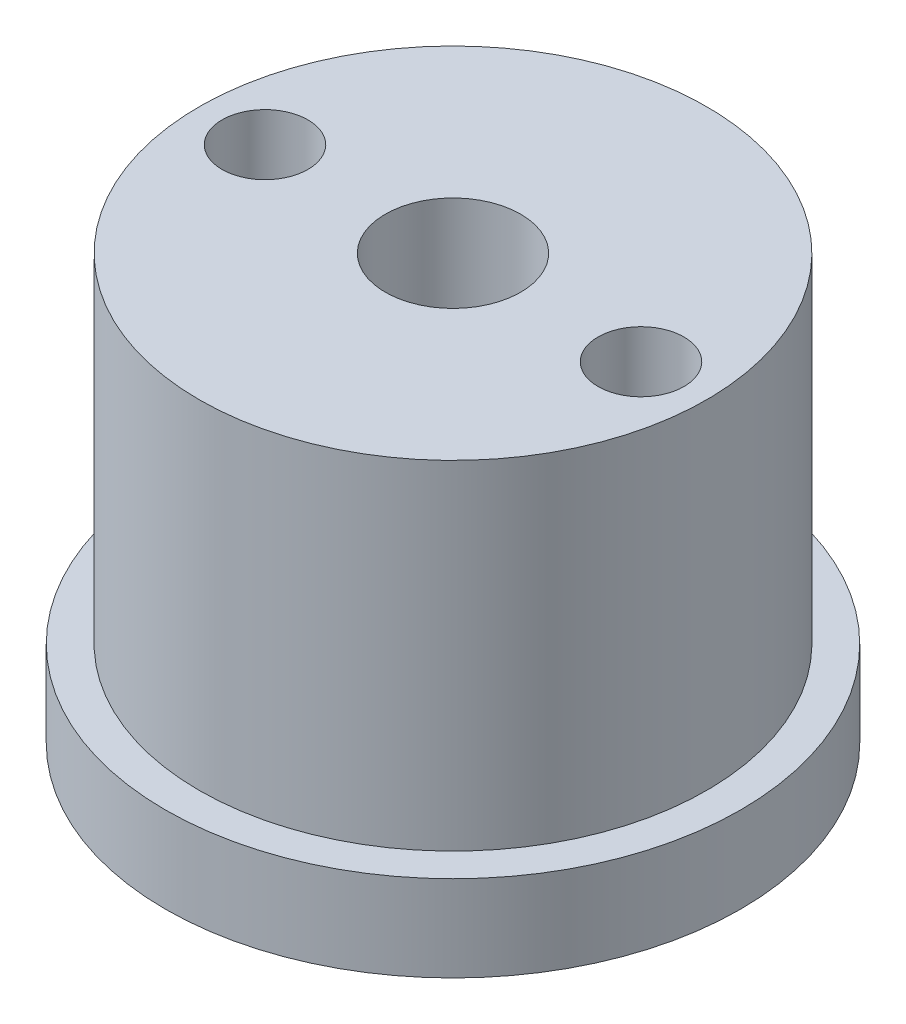
ISO-10303-21;
HEADER;
FILE_DESCRIPTION(('STEP AP214'),'2;1');
FILE_NAME('part.step','',(''),(''),'','','');
FILE_SCHEMA(('AUTOMOTIVE_DESIGN { 1 0 10303 214 1 1 1 1 }'));
ENDSEC;
DATA;
#1=APPLICATION_CONTEXT('core data for automotive mechanical design processes');
#2=APPLICATION_PROTOCOL_DEFINITION('international standard','automotive_design',2000,#1);
#3=PRODUCT_CONTEXT('',#1,'mechanical');
#4=PRODUCT('Part','Part','',(#3));
#5=PRODUCT_RELATED_PRODUCT_CATEGORY('part','',(#4));
#6=PRODUCT_DEFINITION_FORMATION('','',#4);
#7=PRODUCT_DEFINITION_CONTEXT('part definition',#1,'design');
#8=PRODUCT_DEFINITION('design','',#6,#7);
#9=PRODUCT_DEFINITION_SHAPE('','',#8);
#10=(LENGTH_UNIT() NAMED_UNIT(*) SI_UNIT(.MILLI.,.METRE.));
#11=(NAMED_UNIT(*) PLANE_ANGLE_UNIT() SI_UNIT($,.RADIAN.));
#12=(NAMED_UNIT(*) SI_UNIT($,.STERADIAN.) SOLID_ANGLE_UNIT());
#13=UNCERTAINTY_MEASURE_WITH_UNIT(LENGTH_MEASURE(1.E-05),#10,'distance_accuracy_value','');
#14=(GEOMETRIC_REPRESENTATION_CONTEXT(3) GLOBAL_UNCERTAINTY_ASSIGNED_CONTEXT((#13)) GLOBAL_UNIT_ASSIGNED_CONTEXT((#10,
#11,#12)) REPRESENTATION_CONTEXT('',''));
#15=CARTESIAN_POINT('',(0.,0.,0.));
#16=DIRECTION('',(0.,0.,1.));
#17=DIRECTION('',(1.,0.,0.));
#18=AXIS2_PLACEMENT_3D('',#15,#16,#17);
#19=CARTESIAN_POINT('',(0.,10.,0.));
#20=DIRECTION('',(0.,1.,0.));
#21=DIRECTION('',(0.,0.,1.));
#22=AXIS2_PLACEMENT_3D('',#19,#20,#21);
#23=CYLINDRICAL_SURFACE('',#22,7.5);
#24=CARTESIAN_POINT('',(0.,0.,0.));
#25=DIRECTION('',(0.,1.,0.));
#26=DIRECTION('',(0.,0.,1.));
#27=AXIS2_PLACEMENT_3D('',#24,#25,#26);
#28=CIRCLE('',#27,7.5);
#29=CARTESIAN_POINT('',(0.,0.,7.5));
#30=VERTEX_POINT('',#29);
#31=EDGE_CURVE('E52',#30,#30,#28,.T.);
#32=ORIENTED_EDGE('',*,*,#31,.T.);
#33=EDGE_LOOP('',(#32));
#34=FACE_BOUND('',#33,.T.);
#35=CARTESIAN_POINT('',(0.,10.,0.));
#36=DIRECTION('',(0.,1.,0.));
#37=DIRECTION('',(0.,0.,1.));
#38=AXIS2_PLACEMENT_3D('',#35,#36,#37);
#39=CIRCLE('',#38,7.5);
#40=CARTESIAN_POINT('',(0.,10.,7.5));
#41=VERTEX_POINT('',#40);
#42=EDGE_CURVE('E10',#41,#41,#39,.T.);
#43=ORIENTED_EDGE('',*,*,#42,.F.);
#44=EDGE_LOOP('',(#43));
#45=FACE_BOUND('',#44,.T.);
#46=ADVANCED_FACE('F31',(#34,#45),#23,.T.);
#47=CARTESIAN_POINT('',(-7.5,10.,0.));
#48=DIRECTION('',(0.,1.,0.));
#49=DIRECTION('',(0.,0.,1.));
#50=AXIS2_PLACEMENT_3D('',#47,#48,#49);
#51=PLANE('',#50);
#52=CARTESIAN_POINT('',(0.,10.,0.));
#53=DIRECTION('',(0.,-1.,0.));
#54=DIRECTION('',(0.,0.,-1.));
#55=AXIS2_PLACEMENT_3D('',#52,#53,#54);
#56=CIRCLE('',#55,2.);
#57=CARTESIAN_POINT('',(0.,10.,-2.));
#58=VERTEX_POINT('',#57);
#59=EDGE_CURVE('E59',#58,#58,#56,.T.);
#60=ORIENTED_EDGE('',*,*,#59,.T.);
#61=EDGE_LOOP('',(#60));
#62=FACE_BOUND('',#61,.T.);
#63=CARTESIAN_POINT('',(-5.55625,10.,0.));
#64=DIRECTION('',(0.,1.,0.));
#65=DIRECTION('',(0.,0.,1.));
#66=AXIS2_PLACEMENT_3D('',#63,#64,#65);
#67=CIRCLE('',#66,1.27);
#68=CARTESIAN_POINT('',(-5.55625,10.,1.27));
#69=VERTEX_POINT('',#68);
#70=EDGE_CURVE('E48',#69,#69,#67,.T.);
#71=ORIENTED_EDGE('',*,*,#70,.F.);
#72=EDGE_LOOP('',(#71));
#73=FACE_BOUND('',#72,.T.);
#74=CARTESIAN_POINT('',(5.55625,10.,0.));
#75=DIRECTION('',(0.,1.,0.));
#76=DIRECTION('',(0.,0.,1.));
#77=AXIS2_PLACEMENT_3D('',#74,#75,#76);
#78=CIRCLE('',#77,1.27);
#79=CARTESIAN_POINT('',(5.55625,10.,1.27));
#80=VERTEX_POINT('',#79);
#81=EDGE_CURVE('E54',#80,#80,#78,.T.);
#82=ORIENTED_EDGE('',*,*,#81,.F.);
#83=EDGE_LOOP('',(#82));
#84=FACE_BOUND('',#83,.T.);
#85=ORIENTED_EDGE('',*,*,#42,.T.);
#86=EDGE_LOOP('',(#85));
#87=FACE_BOUND('',#86,.T.);
#88=ADVANCED_FACE('F83',(#62,#73,#84,#87),#51,.T.);
#89=CARTESIAN_POINT('',(-8.5,-2.54,0.));
#90=DIRECTION('',(0.,-1.,0.));
#91=DIRECTION('',(0.,0.,-1.));
#92=AXIS2_PLACEMENT_3D('',#89,#90,#91);
#93=PLANE('',#92);
#94=CARTESIAN_POINT('',(0.,-2.54,0.));
#95=DIRECTION('',(0.,-1.,0.));
#96=DIRECTION('',(0.,0.,-1.));
#97=AXIS2_PLACEMENT_3D('',#94,#95,#96);
#98=CIRCLE('',#97,2.);
#99=CARTESIAN_POINT('',(0.,-2.54,-2.));
#100=VERTEX_POINT('',#99);
#101=EDGE_CURVE('E62',#100,#100,#98,.T.);
#102=ORIENTED_EDGE('',*,*,#101,.F.);
#103=EDGE_LOOP('',(#102));
#104=FACE_BOUND('',#103,.T.);
#105=CARTESIAN_POINT('',(-5.55625,-2.54,0.));
#106=DIRECTION('',(0.,-1.,0.));
#107=DIRECTION('',(0.,0.,-1.));
#108=AXIS2_PLACEMENT_3D('',#105,#106,#107);
#109=CIRCLE('',#108,1.27);
#110=CARTESIAN_POINT('',(-5.55625,-2.54,-1.27));
#111=VERTEX_POINT('',#110);
#112=EDGE_CURVE('E34',#111,#111,#109,.T.);
#113=ORIENTED_EDGE('',*,*,#112,.F.);
#114=EDGE_LOOP('',(#113));
#115=FACE_BOUND('',#114,.T.);
#116=CARTESIAN_POINT('',(5.55625,-2.54,0.));
#117=DIRECTION('',(0.,-1.,0.));
#118=DIRECTION('',(0.,0.,-1.));
#119=AXIS2_PLACEMENT_3D('',#116,#117,#118);
#120=CIRCLE('',#119,1.27);
#121=CARTESIAN_POINT('',(5.55625,-2.54,-1.27));
#122=VERTEX_POINT('',#121);
#123=EDGE_CURVE('E46',#122,#122,#120,.T.);
#124=ORIENTED_EDGE('',*,*,#123,.F.);
#125=EDGE_LOOP('',(#124));
#126=FACE_BOUND('',#125,.T.);
#127=CARTESIAN_POINT('',(0.,-2.54,0.));
#128=DIRECTION('',(0.,1.,0.));
#129=DIRECTION('',(0.,0.,1.));
#130=AXIS2_PLACEMENT_3D('',#127,#128,#129);
#131=CIRCLE('',#130,8.5);
#132=CARTESIAN_POINT('',(0.,-2.54,8.5));
#133=VERTEX_POINT('',#132);
#134=EDGE_CURVE('E38',#133,#133,#131,.T.);
#135=ORIENTED_EDGE('',*,*,#134,.F.);
#136=EDGE_LOOP('',(#135));
#137=FACE_BOUND('',#136,.T.);
#138=ADVANCED_FACE('F74',(#104,#115,#126,#137),#93,.T.);
#139=CARTESIAN_POINT('',(0.,10.,0.));
#140=DIRECTION('',(0.,1.,0.));
#141=DIRECTION('',(0.,0.,1.));
#142=AXIS2_PLACEMENT_3D('',#139,#140,#141);
#143=CYLINDRICAL_SURFACE('',#142,8.5);
#144=ORIENTED_EDGE('',*,*,#134,.T.);
#145=EDGE_LOOP('',(#144));
#146=FACE_BOUND('',#145,.T.);
#147=CARTESIAN_POINT('',(0.,0.,0.));
#148=DIRECTION('',(0.,1.,0.));
#149=DIRECTION('',(0.,0.,1.));
#150=AXIS2_PLACEMENT_3D('',#147,#148,#149);
#151=CIRCLE('',#150,8.5);
#152=CARTESIAN_POINT('',(0.,0.,8.5));
#153=VERTEX_POINT('',#152);
#154=EDGE_CURVE('E43',#153,#153,#151,.T.);
#155=ORIENTED_EDGE('',*,*,#154,.F.);
#156=EDGE_LOOP('',(#155));
#157=FACE_BOUND('',#156,.T.);
#158=ADVANCED_FACE('F72',(#146,#157),#143,.T.);
#159=CARTESIAN_POINT('',(-7.5,0.,0.));
#160=DIRECTION('',(0.,1.,0.));
#161=DIRECTION('',(0.,0.,1.));
#162=AXIS2_PLACEMENT_3D('',#159,#160,#161);
#163=PLANE('',#162);
#164=ORIENTED_EDGE('',*,*,#154,.T.);
#165=EDGE_LOOP('',(#164));
#166=FACE_BOUND('',#165,.T.);
#167=ORIENTED_EDGE('',*,*,#31,.F.);
#168=EDGE_LOOP('',(#167));
#169=FACE_BOUND('',#168,.T.);
#170=ADVANCED_FACE('F69',(#166,#169),#163,.T.);
#171=CARTESIAN_POINT('',(5.55625,-2.7,0.));
#172=DIRECTION('',(0.,1.,0.));
#173=DIRECTION('',(0.,0.,1.));
#174=AXIS2_PLACEMENT_3D('',#171,#172,#173);
#175=CYLINDRICAL_SURFACE('',#174,1.27);
#176=ORIENTED_EDGE('',*,*,#123,.T.);
#177=EDGE_LOOP('',(#176));
#178=FACE_BOUND('',#177,.T.);
#179=ORIENTED_EDGE('',*,*,#81,.T.);
#180=EDGE_LOOP('',(#179));
#181=FACE_BOUND('',#180,.T.);
#182=ADVANCED_FACE('F81',(#178,#181),#175,.F.);
#183=CARTESIAN_POINT('',(-5.55625,-2.7,0.));
#184=DIRECTION('',(0.,1.,0.));
#185=DIRECTION('',(0.,0.,1.));
#186=AXIS2_PLACEMENT_3D('',#183,#184,#185);
#187=CYLINDRICAL_SURFACE('',#186,1.27);
#188=ORIENTED_EDGE('',*,*,#112,.T.);
#189=EDGE_LOOP('',(#188));
#190=FACE_BOUND('',#189,.T.);
#191=ORIENTED_EDGE('',*,*,#70,.T.);
#192=EDGE_LOOP('',(#191));
#193=FACE_BOUND('',#192,.T.);
#194=ADVANCED_FACE('F103',(#190,#193),#187,.F.);
#195=CARTESIAN_POINT('',(0.,10.,0.));
#196=DIRECTION('',(0.,-1.,0.));
#197=DIRECTION('',(0.,0.,-1.));
#198=AXIS2_PLACEMENT_3D('',#195,#196,#197);
#199=CYLINDRICAL_SURFACE('',#198,2.);
#200=ORIENTED_EDGE('',*,*,#59,.F.);
#201=EDGE_LOOP('',(#200));
#202=FACE_BOUND('',#201,.T.);
#203=ORIENTED_EDGE('',*,*,#101,.T.);
#204=EDGE_LOOP('',(#203));
#205=FACE_BOUND('',#204,.T.);
#206=ADVANCED_FACE('F108',(#202,#205),#199,.F.);
#207=CLOSED_SHELL('',(#46,#88,#138,#158,#170,#182,#194,#206));
#208=MANIFOLD_SOLID_BREP('B2',#207);
#209=ADVANCED_BREP_SHAPE_REPRESENTATION('',(#18,#208),#14);
#210=SHAPE_DEFINITION_REPRESENTATION(#9,#209);
ENDSEC;
END-ISO-10303-21;
